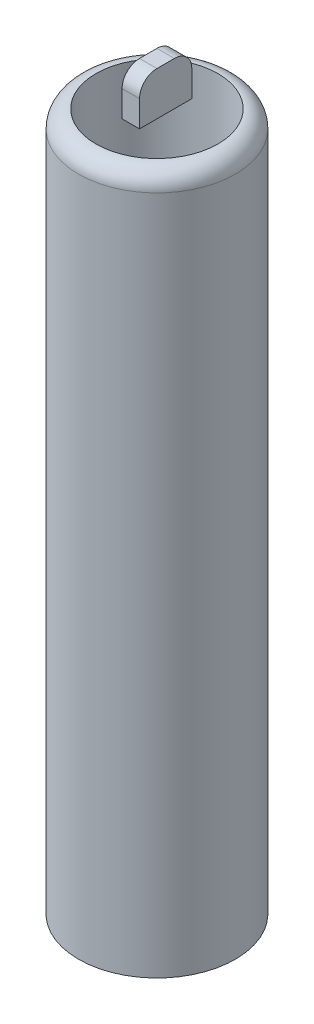
ISO-10303-21;
HEADER;
FILE_DESCRIPTION(('STEP AP214'),'2;1');
FILE_NAME('part.step','',(''),(''),'','','');
FILE_SCHEMA(('AUTOMOTIVE_DESIGN { 1 0 10303 214 1 1 1 1 }'));
ENDSEC;
DATA;
#1=APPLICATION_CONTEXT('core data for automotive mechanical design processes');
#2=APPLICATION_PROTOCOL_DEFINITION('international standard','automotive_design',2000,#1);
#3=PRODUCT_CONTEXT('',#1,'mechanical');
#4=PRODUCT('Part','Part','',(#3));
#5=PRODUCT_RELATED_PRODUCT_CATEGORY('part','',(#4));
#6=PRODUCT_DEFINITION_FORMATION('','',#4);
#7=PRODUCT_DEFINITION_CONTEXT('part definition',#1,'design');
#8=PRODUCT_DEFINITION('design','',#6,#7);
#9=PRODUCT_DEFINITION_SHAPE('','',#8);
#10=(LENGTH_UNIT() NAMED_UNIT(*) SI_UNIT(.MILLI.,.METRE.));
#11=(NAMED_UNIT(*) PLANE_ANGLE_UNIT() SI_UNIT($,.RADIAN.));
#12=(NAMED_UNIT(*) SI_UNIT($,.STERADIAN.) SOLID_ANGLE_UNIT());
#13=UNCERTAINTY_MEASURE_WITH_UNIT(LENGTH_MEASURE(1.E-05),#10,'distance_accuracy_value','');
#14=(GEOMETRIC_REPRESENTATION_CONTEXT(3) GLOBAL_UNCERTAINTY_ASSIGNED_CONTEXT((#13)) GLOBAL_UNIT_ASSIGNED_CONTEXT((#10,
#11,#12)) REPRESENTATION_CONTEXT('',''));
#15=CARTESIAN_POINT('',(0.,0.,0.));
#16=DIRECTION('',(0.,0.,1.));
#17=DIRECTION('',(1.,0.,0.));
#18=AXIS2_PLACEMENT_3D('',#15,#16,#17);
#19=CARTESIAN_POINT('',(1.,85.,-3.));
#20=DIRECTION('',(-1.,0.,0.));
#21=DIRECTION('',(0.,0.,1.));
#22=AXIS2_PLACEMENT_3D('',#19,#20,#21);
#23=PLANE('',#22);
#24=DIRECTION('',(0.,0.,-1.));
#25=VECTOR('',#24,1.);
#26=CARTESIAN_POINT('',(1.,85.,-3.));
#27=LINE('',#26,#25);
#28=CARTESIAN_POINT('',(1.,85.,1.));
#29=VERTEX_POINT('',#28);
#30=CARTESIAN_POINT('',(1.,85.,-1.));
#31=VERTEX_POINT('',#30);
#32=EDGE_CURVE('E126',#29,#31,#27,.T.);
#33=ORIENTED_EDGE('',*,*,#32,.F.);
#34=CARTESIAN_POINT('',(1.,83.,1.));
#35=DIRECTION('',(-1.,0.,0.));
#36=DIRECTION('',(0.,0.,1.));
#37=AXIS2_PLACEMENT_3D('',#34,#35,#36);
#38=CIRCLE('',#37,2.);
#39=CARTESIAN_POINT('',(1.,83.,3.));
#40=VERTEX_POINT('',#39);
#41=EDGE_CURVE('E65',#29,#40,#38,.F.);
#42=ORIENTED_EDGE('',*,*,#41,.T.);
#43=DIRECTION('',(0.,-1.,0.));
#44=VECTOR('',#43,1.);
#45=CARTESIAN_POINT('',(1.,85.,3.));
#46=LINE('',#45,#44);
#47=CARTESIAN_POINT('',(1.,80.,3.));
#48=VERTEX_POINT('',#47);
#49=EDGE_CURVE('E116',#40,#48,#46,.T.);
#50=ORIENTED_EDGE('',*,*,#49,.T.);
#51=DIRECTION('',(0.,0.,-1.));
#52=VECTOR('',#51,1.);
#53=CARTESIAN_POINT('',(1.,80.,-3.));
#54=LINE('',#53,#52);
#55=CARTESIAN_POINT('',(1.,80.,-3.));
#56=VERTEX_POINT('',#55);
#57=EDGE_CURVE('E112',#48,#56,#54,.T.);
#58=ORIENTED_EDGE('',*,*,#57,.T.);
#59=DIRECTION('',(0.,-1.,0.));
#60=VECTOR('',#59,1.);
#61=CARTESIAN_POINT('',(1.,85.,-3.));
#62=LINE('',#61,#60);
#63=CARTESIAN_POINT('',(1.,83.,-3.));
#64=VERTEX_POINT('',#63);
#65=EDGE_CURVE('E94',#64,#56,#62,.T.);
#66=ORIENTED_EDGE('',*,*,#65,.F.);
#67=CARTESIAN_POINT('',(1.,83.,-1.));
#68=DIRECTION('',(-1.,0.,0.));
#69=DIRECTION('',(0.,0.,1.));
#70=AXIS2_PLACEMENT_3D('',#67,#68,#69);
#71=CIRCLE('',#70,2.);
#72=EDGE_CURVE('E136',#64,#31,#71,.F.);
#73=ORIENTED_EDGE('',*,*,#72,.T.);
#74=EDGE_LOOP('',(#33,#42,#50,#58,#66,#73));
#75=FACE_BOUND('',#74,.T.);
#76=ADVANCED_FACE('F43',(#75),#23,.F.);
#77=CARTESIAN_POINT('',(-1.,85.,-3.));
#78=DIRECTION('',(0.,0.,1.));
#79=DIRECTION('',(1.,0.,0.));
#80=AXIS2_PLACEMENT_3D('',#77,#78,#79);
#81=PLANE('',#80);
#82=DIRECTION('',(0.,-1.,0.));
#83=VECTOR('',#82,1.);
#84=CARTESIAN_POINT('',(-1.,85.,-3.));
#85=LINE('',#84,#83);
#86=CARTESIAN_POINT('',(-1.,83.,-3.));
#87=VERTEX_POINT('',#86);
#88=CARTESIAN_POINT('',(-1.,80.,-3.));
#89=VERTEX_POINT('',#88);
#90=EDGE_CURVE('E106',#87,#89,#85,.T.);
#91=ORIENTED_EDGE('',*,*,#90,.F.);
#92=DIRECTION('',(-1.,0.,0.));
#93=VECTOR('',#92,1.);
#94=CARTESIAN_POINT('',(1.,83.,-3.));
#95=LINE('',#94,#93);
#96=EDGE_CURVE('E101',#87,#64,#95,.F.);
#97=ORIENTED_EDGE('',*,*,#96,.T.);
#98=ORIENTED_EDGE('',*,*,#65,.T.);
#99=DIRECTION('',(-1.,0.,0.));
#100=VECTOR('',#99,1.);
#101=CARTESIAN_POINT('',(-1.,80.,-3.));
#102=LINE('',#101,#100);
#103=EDGE_CURVE('E98',#56,#89,#102,.T.);
#104=ORIENTED_EDGE('',*,*,#103,.T.);
#105=EDGE_LOOP('',(#91,#97,#98,#104));
#106=FACE_BOUND('',#105,.T.);
#107=ADVANCED_FACE('F97',(#106),#81,.F.);
#108=CARTESIAN_POINT('',(-1.,85.,-3.));
#109=DIRECTION('',(1.,0.,0.));
#110=DIRECTION('',(0.,0.,-1.));
#111=AXIS2_PLACEMENT_3D('',#108,#109,#110);
#112=PLANE('',#111);
#113=DIRECTION('',(0.,-1.,0.));
#114=VECTOR('',#113,1.);
#115=CARTESIAN_POINT('',(-1.,85.,3.));
#116=LINE('',#115,#114);
#117=CARTESIAN_POINT('',(-1.,83.,3.));
#118=VERTEX_POINT('',#117);
#119=CARTESIAN_POINT('',(-1.,80.,3.));
#120=VERTEX_POINT('',#119);
#121=EDGE_CURVE('E128',#118,#120,#116,.T.);
#122=ORIENTED_EDGE('',*,*,#121,.F.);
#123=CARTESIAN_POINT('',(-1.,83.,1.));
#124=DIRECTION('',(1.,0.,0.));
#125=DIRECTION('',(0.,0.,-1.));
#126=AXIS2_PLACEMENT_3D('',#123,#124,#125);
#127=CIRCLE('',#126,2.);
#128=CARTESIAN_POINT('',(-1.,85.,1.));
#129=VERTEX_POINT('',#128);
#130=EDGE_CURVE('E12',#118,#129,#127,.F.);
#131=ORIENTED_EDGE('',*,*,#130,.T.);
#132=DIRECTION('',(0.,0.,1.));
#133=VECTOR('',#132,1.);
#134=CARTESIAN_POINT('',(-1.,85.,-3.));
#135=LINE('',#134,#133);
#136=CARTESIAN_POINT('',(-1.,85.,-1.));
#137=VERTEX_POINT('',#136);
#138=EDGE_CURVE('E120',#137,#129,#135,.T.);
#139=ORIENTED_EDGE('',*,*,#138,.F.);
#140=CARTESIAN_POINT('',(-1.,83.,-1.));
#141=DIRECTION('',(1.,0.,0.));
#142=DIRECTION('',(0.,0.,-1.));
#143=AXIS2_PLACEMENT_3D('',#140,#141,#142);
#144=CIRCLE('',#143,2.);
#145=EDGE_CURVE('E133',#137,#87,#144,.F.);
#146=ORIENTED_EDGE('',*,*,#145,.T.);
#147=ORIENTED_EDGE('',*,*,#90,.T.);
#148=DIRECTION('',(0.,0.,1.));
#149=VECTOR('',#148,1.);
#150=CARTESIAN_POINT('',(-1.,80.,-3.));
#151=LINE('',#150,#149);
#152=EDGE_CURVE('E114',#89,#120,#151,.T.);
#153=ORIENTED_EDGE('',*,*,#152,.T.);
#154=EDGE_LOOP('',(#122,#131,#139,#146,#147,#153));
#155=FACE_BOUND('',#154,.T.);
#156=ADVANCED_FACE('F152',(#155),#112,.F.);
#157=CARTESIAN_POINT('',(-1.,85.,3.));
#158=DIRECTION('',(0.,0.,-1.));
#159=DIRECTION('',(-1.,0.,0.));
#160=AXIS2_PLACEMENT_3D('',#157,#158,#159);
#161=PLANE('',#160);
#162=ORIENTED_EDGE('',*,*,#49,.F.);
#163=DIRECTION('',(1.,0.,0.));
#164=VECTOR('',#163,1.);
#165=CARTESIAN_POINT('',(-1.,83.,3.));
#166=LINE('',#165,#164);
#167=EDGE_CURVE('E51',#40,#118,#166,.F.);
#168=ORIENTED_EDGE('',*,*,#167,.T.);
#169=ORIENTED_EDGE('',*,*,#121,.T.);
#170=DIRECTION('',(1.,0.,0.));
#171=VECTOR('',#170,1.);
#172=CARTESIAN_POINT('',(-1.,80.,3.));
#173=LINE('',#172,#171);
#174=EDGE_CURVE('E124',#120,#48,#173,.T.);
#175=ORIENTED_EDGE('',*,*,#174,.T.);
#176=EDGE_LOOP('',(#162,#168,#169,#175));
#177=FACE_BOUND('',#176,.T.);
#178=ADVANCED_FACE('F166',(#177),#161,.F.);
#179=CARTESIAN_POINT('',(0.,85.,0.));
#180=DIRECTION('',(0.,1.,0.));
#181=DIRECTION('',(0.,0.,1.));
#182=AXIS2_PLACEMENT_3D('',#179,#180,#181);
#183=PLANE('',#182);
#184=ORIENTED_EDGE('',*,*,#138,.T.);
#185=DIRECTION('',(1.,0.,0.));
#186=VECTOR('',#185,1.);
#187=CARTESIAN_POINT('',(1.,85.,1.));
#188=LINE('',#187,#186);
#189=EDGE_CURVE('E138',#129,#29,#188,.T.);
#190=ORIENTED_EDGE('',*,*,#189,.T.);
#191=ORIENTED_EDGE('',*,*,#32,.T.);
#192=DIRECTION('',(-1.,0.,0.));
#193=VECTOR('',#192,1.);
#194=CARTESIAN_POINT('',(-1.,85.,-1.));
#195=LINE('',#194,#193);
#196=EDGE_CURVE('E105',#31,#137,#195,.T.);
#197=ORIENTED_EDGE('',*,*,#196,.T.);
#198=EDGE_LOOP('',(#184,#190,#191,#197));
#199=FACE_BOUND('',#198,.T.);
#200=ADVANCED_FACE('F144',(#199),#183,.T.);
#201=CARTESIAN_POINT('',(0.,80.,0.));
#202=DIRECTION('',(0.,1.,0.));
#203=DIRECTION('',(0.,0.,1.));
#204=AXIS2_PLACEMENT_3D('',#201,#202,#203);
#205=PLANE('',#204);
#206=ORIENTED_EDGE('',*,*,#57,.F.);
#207=ORIENTED_EDGE('',*,*,#174,.F.);
#208=ORIENTED_EDGE('',*,*,#152,.F.);
#209=ORIENTED_EDGE('',*,*,#103,.F.);
#210=EDGE_LOOP('',(#206,#207,#208,#209));
#211=FACE_BOUND('',#210,.T.);
#212=ADVANCED_FACE('F110',(#211),#205,.F.);
#213=CARTESIAN_POINT('',(0.,83.,-1.));
#214=DIRECTION('',(1.,0.,0.));
#215=DIRECTION('',(0.,0.,-1.));
#216=AXIS2_PLACEMENT_3D('',#213,#214,#215);
#217=CYLINDRICAL_SURFACE('',#216,2.);
#218=ORIENTED_EDGE('',*,*,#72,.F.);
#219=ORIENTED_EDGE('',*,*,#96,.F.);
#220=ORIENTED_EDGE('',*,*,#145,.F.);
#221=ORIENTED_EDGE('',*,*,#196,.F.);
#222=EDGE_LOOP('',(#218,#219,#220,#221));
#223=FACE_BOUND('',#222,.T.);
#224=ADVANCED_FACE('F150',(#223),#217,.T.);
#225=CARTESIAN_POINT('',(0.,83.,1.));
#226=DIRECTION('',(-1.,0.,0.));
#227=DIRECTION('',(0.,0.,1.));
#228=AXIS2_PLACEMENT_3D('',#225,#226,#227);
#229=CYLINDRICAL_SURFACE('',#228,2.);
#230=ORIENTED_EDGE('',*,*,#130,.F.);
#231=ORIENTED_EDGE('',*,*,#167,.F.);
#232=ORIENTED_EDGE('',*,*,#41,.F.);
#233=ORIENTED_EDGE('',*,*,#189,.F.);
#234=EDGE_LOOP('',(#230,#231,#232,#233));
#235=FACE_BOUND('',#234,.T.);
#236=ADVANCED_FACE('F45',(#235),#229,.T.);
#237=CLOSED_SHELL('',(#76,#107,#156,#178,#200,#212,#224,#236));
#238=MANIFOLD_SOLID_BREP('B2',#237);
#239=CARTESIAN_POINT('',(0.,80.,0.));
#240=DIRECTION('',(0.,-1.,0.));
#241=DIRECTION('',(0.,0.,-1.));
#242=AXIS2_PLACEMENT_3D('',#239,#240,#241);
#243=CYLINDRICAL_SURFACE('',#242,9.);
#244=CARTESIAN_POINT('',(0.,78.,0.));
#245=DIRECTION('',(0.,1.,0.));
#246=DIRECTION('',(0.,0.,1.));
#247=AXIS2_PLACEMENT_3D('',#244,#245,#246);
#248=CIRCLE('',#247,9.);
#249=CARTESIAN_POINT('',(0.,78.,9.));
#250=VERTEX_POINT('',#249);
#251=EDGE_CURVE('E42',#250,#250,#248,.F.);
#252=ORIENTED_EDGE('',*,*,#251,.T.);
#253=EDGE_LOOP('',(#252));
#254=FACE_BOUND('',#253,.T.);
#255=CARTESIAN_POINT('',(0.,0.,0.));
#256=DIRECTION('',(0.,1.,0.));
#257=DIRECTION('',(0.,0.,1.));
#258=AXIS2_PLACEMENT_3D('',#255,#256,#257);
#259=CIRCLE('',#258,9.);
#260=CARTESIAN_POINT('',(0.,0.,9.));
#261=VERTEX_POINT('',#260);
#262=EDGE_CURVE('E226',#261,#261,#259,.T.);
#263=ORIENTED_EDGE('',*,*,#262,.T.);
#264=EDGE_LOOP('',(#263));
#265=FACE_BOUND('',#264,.T.);
#266=ADVANCED_FACE('F219',(#254,#265),#243,.T.);
#267=CARTESIAN_POINT('',(0.,0.,0.));
#268=DIRECTION('',(0.,1.,0.));
#269=DIRECTION('',(0.,0.,1.));
#270=AXIS2_PLACEMENT_3D('',#267,#268,#269);
#271=PLANE('',#270);
#272=CARTESIAN_POINT('',(0.,0.,0.));
#273=DIRECTION('',(0.,-1.,0.));
#274=DIRECTION('',(0.,0.,-1.));
#275=AXIS2_PLACEMENT_3D('',#272,#273,#274);
#276=CIRCLE('',#275,7.);
#277=CARTESIAN_POINT('',(0.,0.,-7.));
#278=VERTEX_POINT('',#277);
#279=EDGE_CURVE('E234',#278,#278,#276,.T.);
#280=ORIENTED_EDGE('',*,*,#279,.F.);
#281=EDGE_LOOP('',(#280));
#282=FACE_BOUND('',#281,.T.);
#283=ORIENTED_EDGE('',*,*,#262,.F.);
#284=EDGE_LOOP('',(#283));
#285=FACE_BOUND('',#284,.T.);
#286=ADVANCED_FACE('F242',(#282,#285),#271,.F.);
#287=CARTESIAN_POINT('',(0.,80.,0.));
#288=DIRECTION('',(0.,-1.,0.));
#289=DIRECTION('',(0.,0.,-1.));
#290=AXIS2_PLACEMENT_3D('',#287,#288,#289);
#291=CYLINDRICAL_SURFACE('',#290,7.);
#292=CARTESIAN_POINT('',(0.,80.,0.));
#293=DIRECTION('',(0.,-1.,0.));
#294=DIRECTION('',(0.,0.,-1.));
#295=AXIS2_PLACEMENT_3D('',#292,#293,#294);
#296=CIRCLE('',#295,7.);
#297=CARTESIAN_POINT('',(0.,80.,-7.));
#298=VERTEX_POINT('',#297);
#299=EDGE_CURVE('E230',#298,#298,#296,.T.);
#300=ORIENTED_EDGE('',*,*,#299,.F.);
#301=EDGE_LOOP('',(#300));
#302=FACE_BOUND('',#301,.T.);
#303=ORIENTED_EDGE('',*,*,#279,.T.);
#304=EDGE_LOOP('',(#303));
#305=FACE_BOUND('',#304,.T.);
#306=ADVANCED_FACE('F240',(#302,#305),#291,.F.);
#307=CARTESIAN_POINT('',(0.,78.,0.));
#308=DIRECTION('',(0.,1.,0.));
#309=DIRECTION('',(0.,0.,1.));
#310=AXIS2_PLACEMENT_3D('',#307,#308,#309);
#311=TOROIDAL_SURFACE('',#310,7.,2.);
#312=ORIENTED_EDGE('',*,*,#251,.F.);
#313=EDGE_LOOP('',(#312));
#314=FACE_BOUND('',#313,.T.);
#315=ORIENTED_EDGE('',*,*,#299,.T.);
#316=EDGE_LOOP('',(#315));
#317=FACE_BOUND('',#316,.T.);
#318=ADVANCED_FACE('F221',(#314,#317),#311,.T.);
#319=CLOSED_SHELL('',(#266,#286,#306,#318));
#320=MANIFOLD_SOLID_BREP('B6',#319);
#321=ADVANCED_BREP_SHAPE_REPRESENTATION('',(#18,#238,#320),#14);
#322=SHAPE_DEFINITION_REPRESENTATION(#9,#321);
ENDSEC;
END-ISO-10303-21;
